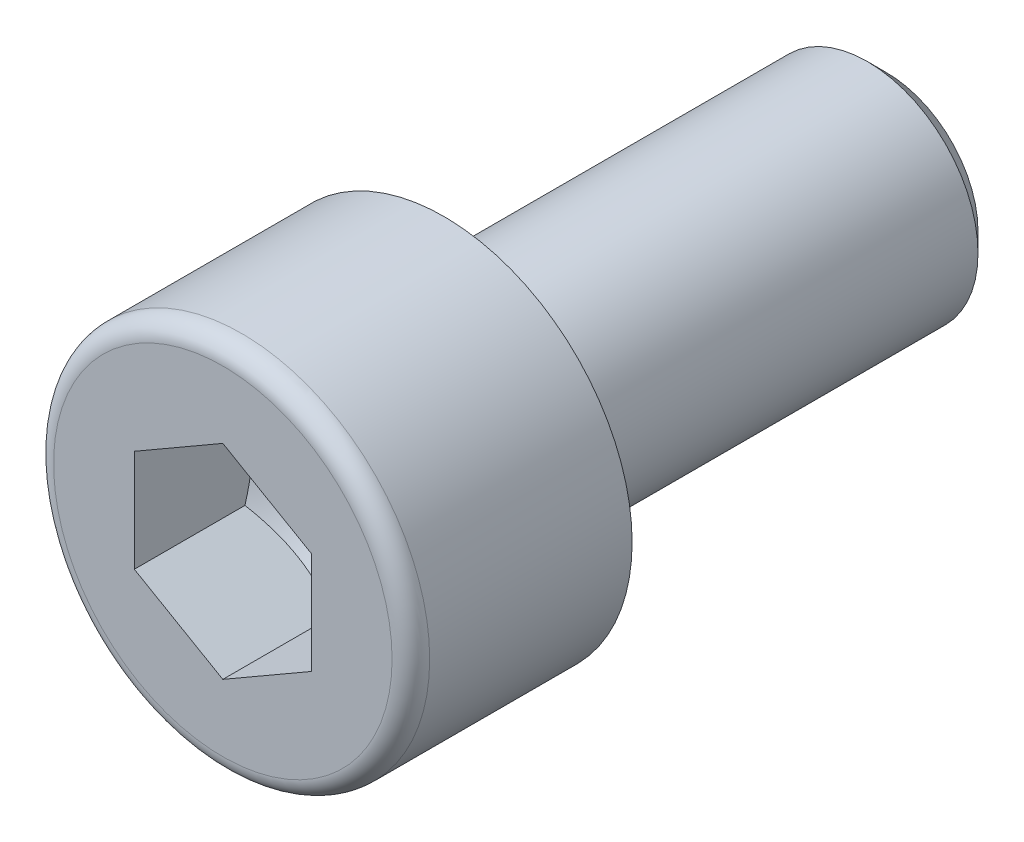
ISO-10303-21;
HEADER;
FILE_DESCRIPTION(('STEP AP214'),'2;1');
FILE_NAME('part.step','',(''),(''),'','','');
FILE_SCHEMA(('AUTOMOTIVE_DESIGN { 1 0 10303 214 1 1 1 1 }'));
ENDSEC;
DATA;
#1=APPLICATION_CONTEXT('core data for automotive mechanical design processes');
#2=APPLICATION_PROTOCOL_DEFINITION('international standard','automotive_design',2000,#1);
#3=PRODUCT_CONTEXT('',#1,'mechanical');
#4=PRODUCT('Part','Part','',(#3));
#5=PRODUCT_RELATED_PRODUCT_CATEGORY('part','',(#4));
#6=PRODUCT_DEFINITION_FORMATION('','',#4);
#7=PRODUCT_DEFINITION_CONTEXT('part definition',#1,'design');
#8=PRODUCT_DEFINITION('design','',#6,#7);
#9=PRODUCT_DEFINITION_SHAPE('','',#8);
#10=(LENGTH_UNIT() NAMED_UNIT(*) SI_UNIT(.MILLI.,.METRE.));
#11=(NAMED_UNIT(*) PLANE_ANGLE_UNIT() SI_UNIT($,.RADIAN.));
#12=(NAMED_UNIT(*) SI_UNIT($,.STERADIAN.) SOLID_ANGLE_UNIT());
#13=UNCERTAINTY_MEASURE_WITH_UNIT(LENGTH_MEASURE(1.E-05),#10,'distance_accuracy_value','');
#14=(GEOMETRIC_REPRESENTATION_CONTEXT(3) GLOBAL_UNCERTAINTY_ASSIGNED_CONTEXT((#13)) GLOBAL_UNIT_ASSIGNED_CONTEXT((#10,
#11,#12)) REPRESENTATION_CONTEXT('',''));
#15=CARTESIAN_POINT('',(0.,0.,0.));
#16=DIRECTION('',(0.,0.,1.));
#17=DIRECTION('',(1.,0.,0.));
#18=AXIS2_PLACEMENT_3D('',#15,#16,#17);
#19=CARTESIAN_POINT('',(0.,0.,5.));
#20=DIRECTION('',(0.,0.,1.));
#21=DIRECTION('',(1.,0.,0.));
#22=AXIS2_PLACEMENT_3D('',#19,#20,#21);
#23=PLANE('',#22);
#24=CARTESIAN_POINT('',(0.,0.,5.));
#25=DIRECTION('',(0.,0.,1.));
#26=DIRECTION('',(1.,0.,0.));
#27=AXIS2_PLACEMENT_3D('',#24,#25,#26);
#28=CIRCLE('',#27,3.825);
#29=CARTESIAN_POINT('',(3.825,0.,5.));
#30=VERTEX_POINT('',#29);
#31=EDGE_CURVE('E11',#30,#30,#28,.T.);
#32=ORIENTED_EDGE('',*,*,#31,.T.);
#33=EDGE_LOOP('',(#32));
#34=FACE_BOUND('',#33,.T.);
#35=DIRECTION('',(0.,-1.,0.));
#36=VECTOR('',#35,1.);
#37=CARTESIAN_POINT('',(1.99999906749978,1.1547,5.));
#38=LINE('',#37,#36);
#39=CARTESIAN_POINT('',(1.99999906749978,1.1547,5.));
#40=VERTEX_POINT('',#39);
#41=CARTESIAN_POINT('',(1.99999906749978,-1.1547,5.));
#42=VERTEX_POINT('',#41);
#43=EDGE_CURVE('E92',#40,#42,#38,.T.);
#44=ORIENTED_EDGE('',*,*,#43,.T.);
#45=DIRECTION('',(-0.866025403784438,-0.5,0.));
#46=VECTOR('',#45,1.);
#47=CARTESIAN_POINT('',(1.99999906749978,-1.1547,5.));
#48=LINE('',#47,#46);
#49=CARTESIAN_POINT('',(0.,-2.3094,5.));
#50=VERTEX_POINT('',#49);
#51=EDGE_CURVE('E31',#42,#50,#48,.T.);
#52=ORIENTED_EDGE('',*,*,#51,.T.);
#53=DIRECTION('',(-0.866025403784439,0.5,0.));
#54=VECTOR('',#53,1.);
#55=CARTESIAN_POINT('',(0.,-2.3094,5.));
#56=LINE('',#55,#54);
#57=CARTESIAN_POINT('',(-1.99999906749978,-1.1547,5.));
#58=VERTEX_POINT('',#57);
#59=EDGE_CURVE('E169',#50,#58,#56,.T.);
#60=ORIENTED_EDGE('',*,*,#59,.T.);
#61=DIRECTION('',(0.,1.,0.));
#62=VECTOR('',#61,1.);
#63=CARTESIAN_POINT('',(-1.99999906749978,-1.1547,5.));
#64=LINE('',#63,#62);
#65=CARTESIAN_POINT('',(-1.99999906749978,1.1547,5.));
#66=VERTEX_POINT('',#65);
#67=EDGE_CURVE('E165',#58,#66,#64,.T.);
#68=ORIENTED_EDGE('',*,*,#67,.T.);
#69=DIRECTION('',(0.866025403784439,0.5,0.));
#70=VECTOR('',#69,1.);
#71=CARTESIAN_POINT('',(-1.99999906749978,1.1547,5.));
#72=LINE('',#71,#70);
#73=CARTESIAN_POINT('',(0.,2.3094,5.));
#74=VERTEX_POINT('',#73);
#75=EDGE_CURVE('E160',#66,#74,#72,.T.);
#76=ORIENTED_EDGE('',*,*,#75,.T.);
#77=DIRECTION('',(0.866025403784439,-0.5,0.));
#78=VECTOR('',#77,1.);
#79=CARTESIAN_POINT('',(0.,2.3094,5.));
#80=LINE('',#79,#78);
#81=EDGE_CURVE('E96',#74,#40,#80,.T.);
#82=ORIENTED_EDGE('',*,*,#81,.T.);
#83=EDGE_LOOP('',(#44,#52,#60,#68,#76,#82));
#84=FACE_BOUND('',#83,.T.);
#85=ADVANCED_FACE('F17',(#34,#84),#23,.T.);
#86=CARTESIAN_POINT('',(0.,0.,4.575));
#87=DIRECTION('',(0.,0.,1.));
#88=DIRECTION('',(1.,0.,0.));
#89=AXIS2_PLACEMENT_3D('',#86,#87,#88);
#90=TOROIDAL_SURFACE('',#89,3.825,0.425);
#91=ORIENTED_EDGE('',*,*,#31,.F.);
#92=EDGE_LOOP('',(#91));
#93=FACE_BOUND('',#92,.T.);
#94=CARTESIAN_POINT('',(0.,0.,4.575));
#95=DIRECTION('',(0.,0.,1.));
#96=DIRECTION('',(1.,0.,0.));
#97=AXIS2_PLACEMENT_3D('',#94,#95,#96);
#98=CIRCLE('',#97,4.25);
#99=CARTESIAN_POINT('',(4.25,0.,4.575));
#100=VERTEX_POINT('',#99);
#101=EDGE_CURVE('E24',#100,#100,#98,.T.);
#102=ORIENTED_EDGE('',*,*,#101,.T.);
#103=EDGE_LOOP('',(#102));
#104=FACE_BOUND('',#103,.T.);
#105=ADVANCED_FACE('F133',(#93,#104),#90,.T.);
#106=CARTESIAN_POINT('',(0.,0.,5.));
#107=DIRECTION('',(0.,0.,1.));
#108=DIRECTION('',(1.,0.,0.));
#109=AXIS2_PLACEMENT_3D('',#106,#107,#108);
#110=CYLINDRICAL_SURFACE('',#109,4.25);
#111=CARTESIAN_POINT('',(0.,0.,0.));
#112=DIRECTION('',(0.,0.,1.));
#113=DIRECTION('',(1.,0.,0.));
#114=AXIS2_PLACEMENT_3D('',#111,#112,#113);
#115=CIRCLE('',#114,4.25);
#116=CARTESIAN_POINT('',(4.25,0.,0.));
#117=VERTEX_POINT('',#116);
#118=EDGE_CURVE('E128',#117,#117,#115,.T.);
#119=ORIENTED_EDGE('',*,*,#118,.T.);
#120=EDGE_LOOP('',(#119));
#121=FACE_BOUND('',#120,.T.);
#122=ORIENTED_EDGE('',*,*,#101,.F.);
#123=EDGE_LOOP('',(#122));
#124=FACE_BOUND('',#123,.T.);
#125=ADVANCED_FACE('F135',(#121,#124),#110,.T.);
#126=CARTESIAN_POINT('',(0.,4.25,0.));
#127=DIRECTION('',(0.,0.,-1.));
#128=DIRECTION('',(-1.,0.,0.));
#129=AXIS2_PLACEMENT_3D('',#126,#127,#128);
#130=PLANE('',#129);
#131=CARTESIAN_POINT('',(0.,0.,0.));
#132=DIRECTION('',(0.,0.,1.));
#133=DIRECTION('',(1.,0.,0.));
#134=AXIS2_PLACEMENT_3D('',#131,#132,#133);
#135=CIRCLE('',#134,2.75);
#136=CARTESIAN_POINT('',(2.75,0.,0.));
#137=VERTEX_POINT('',#136);
#138=EDGE_CURVE('E125',#137,#137,#135,.T.);
#139=ORIENTED_EDGE('',*,*,#138,.T.);
#140=EDGE_LOOP('',(#139));
#141=FACE_BOUND('',#140,.T.);
#142=ORIENTED_EDGE('',*,*,#118,.F.);
#143=EDGE_LOOP('',(#142));
#144=FACE_BOUND('',#143,.T.);
#145=ADVANCED_FACE('F137',(#141,#144),#130,.T.);
#146=CARTESIAN_POINT('',(0.,0.,-0.25));
#147=DIRECTION('',(0.,0.,1.));
#148=DIRECTION('',(1.,0.,0.));
#149=AXIS2_PLACEMENT_3D('',#146,#147,#148);
#150=TOROIDAL_SURFACE('',#149,2.75,0.25);
#151=CARTESIAN_POINT('',(0.,0.,-0.25));
#152=DIRECTION('',(0.,0.,1.));
#153=DIRECTION('',(1.,0.,0.));
#154=AXIS2_PLACEMENT_3D('',#151,#152,#153);
#155=CIRCLE('',#154,2.5);
#156=CARTESIAN_POINT('',(2.5,0.,-0.25));
#157=VERTEX_POINT('',#156);
#158=EDGE_CURVE('E122',#157,#157,#155,.T.);
#159=ORIENTED_EDGE('',*,*,#158,.T.);
#160=EDGE_LOOP('',(#159));
#161=FACE_BOUND('',#160,.T.);
#162=ORIENTED_EDGE('',*,*,#138,.F.);
#163=EDGE_LOOP('',(#162));
#164=FACE_BOUND('',#163,.T.);
#165=ADVANCED_FACE('F145',(#161,#164),#150,.F.);
#166=CARTESIAN_POINT('',(0.,0.,5.));
#167=DIRECTION('',(0.,0.,1.));
#168=DIRECTION('',(1.,0.,0.));
#169=AXIS2_PLACEMENT_3D('',#166,#167,#168);
#170=CYLINDRICAL_SURFACE('',#169,2.5);
#171=CARTESIAN_POINT('',(0.,0.,-0.251));
#172=DIRECTION('',(0.,0.,1.));
#173=DIRECTION('',(1.,0.,0.));
#174=AXIS2_PLACEMENT_3D('',#171,#172,#173);
#175=CIRCLE('',#174,2.5);
#176=CARTESIAN_POINT('',(2.5,0.,-0.251));
#177=VERTEX_POINT('',#176);
#178=EDGE_CURVE('E119',#177,#177,#175,.T.);
#179=ORIENTED_EDGE('',*,*,#178,.T.);
#180=EDGE_LOOP('',(#179));
#181=FACE_BOUND('',#180,.T.);
#182=ORIENTED_EDGE('',*,*,#158,.F.);
#183=EDGE_LOOP('',(#182));
#184=FACE_BOUND('',#183,.T.);
#185=ADVANCED_FACE('F312',(#181,#184),#170,.T.);
#186=CARTESIAN_POINT('',(0.,0.,-0.251));
#187=DIRECTION('',(0.,0.,1.));
#188=DIRECTION('',(1.,0.,0.));
#189=AXIS2_PLACEMENT_3D('',#186,#187,#188);
#190=CONICAL_SURFACE('',#189,2.5,0.524755823658084);
#191=CARTESIAN_POINT('',(0.,0.,-0.998977999677323));
#192=DIRECTION('',(0.,0.,1.));
#193=DIRECTION('',(1.,0.,0.));
#194=AXIS2_PLACEMENT_3D('',#191,#192,#193);
#195=CIRCLE('',#194,2.067);
#196=CARTESIAN_POINT('',(2.067,0.,-0.998977999677323));
#197=VERTEX_POINT('',#196);
#198=EDGE_CURVE('E116',#197,#197,#195,.T.);
#199=ORIENTED_EDGE('',*,*,#198,.T.);
#200=EDGE_LOOP('',(#199));
#201=FACE_BOUND('',#200,.T.);
#202=ORIENTED_EDGE('',*,*,#178,.F.);
#203=EDGE_LOOP('',(#202));
#204=FACE_BOUND('',#203,.T.);
#205=ADVANCED_FACE('F304',(#201,#204),#190,.T.);
#206=CARTESIAN_POINT('',(0.,2.067,-0.998977999677323));
#207=DIRECTION('',(0.,0.,1.));
#208=DIRECTION('',(1.,0.,0.));
#209=AXIS2_PLACEMENT_3D('',#206,#207,#208);
#210=PLANE('',#209);
#211=CARTESIAN_POINT('',(0.,0.,-0.998977999677323));
#212=DIRECTION('',(0.,0.,1.));
#213=DIRECTION('',(1.,0.,0.));
#214=AXIS2_PLACEMENT_3D('',#211,#212,#213);
#215=CIRCLE('',#214,2.5);
#216=CARTESIAN_POINT('',(2.5,0.,-0.998977999677323));
#217=VERTEX_POINT('',#216);
#218=EDGE_CURVE('E113',#217,#217,#215,.T.);
#219=ORIENTED_EDGE('',*,*,#218,.T.);
#220=EDGE_LOOP('',(#219));
#221=FACE_BOUND('',#220,.T.);
#222=ORIENTED_EDGE('',*,*,#198,.F.);
#223=EDGE_LOOP('',(#222));
#224=FACE_BOUND('',#223,.T.);
#225=ADVANCED_FACE('F296',(#221,#224),#210,.T.);
#226=CARTESIAN_POINT('',(0.,0.,5.));
#227=DIRECTION('',(0.,0.,1.));
#228=DIRECTION('',(1.,0.,0.));
#229=AXIS2_PLACEMENT_3D('',#226,#227,#228);
#230=CYLINDRICAL_SURFACE('',#229,2.5);
#231=CARTESIAN_POINT('',(0.,0.,-9.567));
#232=DIRECTION('',(0.,0.,1.));
#233=DIRECTION('',(1.,0.,0.));
#234=AXIS2_PLACEMENT_3D('',#231,#232,#233);
#235=CIRCLE('',#234,2.5);
#236=CARTESIAN_POINT('',(2.5,0.,-9.567));
#237=VERTEX_POINT('',#236);
#238=EDGE_CURVE('E110',#237,#237,#235,.T.);
#239=ORIENTED_EDGE('',*,*,#238,.T.);
#240=EDGE_LOOP('',(#239));
#241=FACE_BOUND('',#240,.T.);
#242=ORIENTED_EDGE('',*,*,#218,.F.);
#243=EDGE_LOOP('',(#242));
#244=FACE_BOUND('',#243,.T.);
#245=ADVANCED_FACE('F288',(#241,#244),#230,.T.);
#246=CARTESIAN_POINT('',(0.,0.,-9.567));
#247=DIRECTION('',(0.,0.,1.));
#248=DIRECTION('',(1.,0.,0.));
#249=AXIS2_PLACEMENT_3D('',#246,#247,#248);
#250=CONICAL_SURFACE('',#249,2.5,0.785398163397448);
#251=CARTESIAN_POINT('',(0.,0.,-10.));
#252=DIRECTION('',(0.,0.,1.));
#253=DIRECTION('',(1.,0.,0.));
#254=AXIS2_PLACEMENT_3D('',#251,#252,#253);
#255=CIRCLE('',#254,2.067);
#256=CARTESIAN_POINT('',(2.067,0.,-10.));
#257=VERTEX_POINT('',#256);
#258=EDGE_CURVE('E107',#257,#257,#255,.T.);
#259=ORIENTED_EDGE('',*,*,#258,.T.);
#260=EDGE_LOOP('',(#259));
#261=FACE_BOUND('',#260,.T.);
#262=ORIENTED_EDGE('',*,*,#238,.F.);
#263=EDGE_LOOP('',(#262));
#264=FACE_BOUND('',#263,.T.);
#265=ADVANCED_FACE('F281',(#261,#264),#250,.T.);
#266=CARTESIAN_POINT('',(0.,2.067,-10.));
#267=DIRECTION('',(0.,0.,-1.));
#268=DIRECTION('',(-1.,0.,0.));
#269=AXIS2_PLACEMENT_3D('',#266,#267,#268);
#270=PLANE('',#269);
#271=ORIENTED_EDGE('',*,*,#258,.F.);
#272=EDGE_LOOP('',(#271));
#273=FACE_BOUND('',#272,.T.);
#274=ADVANCED_FACE('F225',(#273),#270,.T.);
#275=CARTESIAN_POINT('',(1.99999906749978,-1.1547,1.16666728833348));
#276=DIRECTION('',(-0.5,0.866025403784439,0.));
#277=DIRECTION('',(0.866025403784438,0.5,0.));
#278=AXIS2_PLACEMENT_3D('',#275,#276,#277);
#279=PLANE('',#278);
#280=DIRECTION('',(0.,0.,1.));
#281=VECTOR('',#280,1.);
#282=CARTESIAN_POINT('',(0.,-2.3094,1.16666728833348));
#283=LINE('',#282,#281);
#284=CARTESIAN_POINT('',(0.,-2.3094,2.5));
#285=VERTEX_POINT('',#284);
#286=EDGE_CURVE('E105',#285,#50,#283,.T.);
#287=ORIENTED_EDGE('',*,*,#286,.T.);
#288=ORIENTED_EDGE('',*,*,#51,.F.);
#289=DIRECTION('',(0.,0.,1.));
#290=VECTOR('',#289,1.);
#291=CARTESIAN_POINT('',(1.99999906749978,-1.1547,1.16666728833348));
#292=LINE('',#291,#290);
#293=CARTESIAN_POINT('',(1.99999906749978,-1.1547,2.5));
#294=VERTEX_POINT('',#293);
#295=EDGE_CURVE('E86',#294,#42,#292,.T.);
#296=ORIENTED_EDGE('',*,*,#295,.F.);
#297=CARTESIAN_POINT('',(-1.99999999564114E-07,-2.30940011547005,2.50000006666667));
#298=CARTESIAN_POINT('',(0.0878876499603639,-2.25865804163694,2.47069561998081));
#299=CARTESIAN_POINT('',(0.176534146583836,-2.20747796294866,2.44404475856418));
#300=CARTESIAN_POINT('',(0.355361994897665,-2.10423165658607,2.39752647848201));
#301=CARTESIAN_POINT('',(0.445546522980522,-2.0521635950207,2.37767551442774));
#302=CARTESIAN_POINT('',(0.624797967396914,-1.94867272533426,2.34677605509165));
#303=CARTESIAN_POINT('',(0.713837311310269,-1.89726583615742,2.33552188284868));
#304=CARTESIAN_POINT('',(0.892334740485718,-1.79421029737332,2.32208925777583));
#305=CARTESIAN_POINT('',(0.981792177402557,-1.74256202208837,2.31989967890714));
#306=CARTESIAN_POINT('',(1.14893382788061,-1.64606274519206,2.32446636389861));
#307=CARTESIAN_POINT('',(1.2266431222988,-1.60119726314119,2.33010135522432));
#308=CARTESIAN_POINT('',(1.38155546038545,-1.51175858304606,2.34795736540739));
#309=CARTESIAN_POINT('',(1.45875796865268,-1.46718569411587,2.36018447788392));
#310=CARTESIAN_POINT('',(1.61398944124535,-1.37756276162779,2.39074989508433));
#311=CARTESIAN_POINT('',(1.69199876882547,-1.3325240553501,2.40921770427432));
#312=CARTESIAN_POINT('',(1.84685425080366,-1.2431182011445,2.45113182458368));
#313=CARTESIAN_POINT('',(1.92370238755192,-1.19874990870617,2.47456829386259));
#314=CARTESIAN_POINT('',(1.99999926749979,-1.15469988452994,2.50000006666667));
#315=B_SPLINE_CURVE_WITH_KNOTS('',3,(#297,#298,#299,#300,#301,#302,#303,#304,#305,#306,#307,
#308,#309,#310,#311,#312,#313,#314),.UNSPECIFIED.,.F.,.F.,(4,2,2,2,2,2,2,2,4),(0.,
0.317015879560132,0.634793553111489,0.944707212041054,1.25424036459456,1.52370723489002,
1.79342362288273,2.06912103104562,2.3442773610271),.UNSPECIFIED.);
#316=EDGE_CURVE('E79',#285,#294,#315,.T.);
#317=ORIENTED_EDGE('',*,*,#316,.F.);
#318=EDGE_LOOP('',(#287,#288,#296,#317));
#319=FACE_BOUND('',#318,.T.);
#320=ADVANCED_FACE('F87',(#319),#279,.T.);
#321=CARTESIAN_POINT('',(0.,-2.3094,1.16666728833348));
#322=DIRECTION('',(0.5,0.866025403784439,0.));
#323=DIRECTION('',(0.866025403784439,-0.5,0.));
#324=AXIS2_PLACEMENT_3D('',#321,#322,#323);
#325=PLANE('',#324);
#326=DIRECTION('',(0.,0.,1.));
#327=VECTOR('',#326,1.);
#328=CARTESIAN_POINT('',(-1.99999906749978,-1.1547,1.16666728833348));
#329=LINE('',#328,#327);
#330=CARTESIAN_POINT('',(-1.99999906749978,-1.1547,2.5));
#331=VERTEX_POINT('',#330);
#332=EDGE_CURVE('E103',#331,#58,#329,.T.);
#333=ORIENTED_EDGE('',*,*,#332,.T.);
#334=ORIENTED_EDGE('',*,*,#59,.F.);
#335=ORIENTED_EDGE('',*,*,#286,.F.);
#336=CARTESIAN_POINT('',(-1.99999926749979,-1.15469988452995,2.50000006666667));
#337=CARTESIAN_POINT('',(-1.91211141753942,-1.20544195836306,2.47069561998081));
#338=CARTESIAN_POINT('',(-1.82346492091595,-1.25662203705134,2.44404475856418));
#339=CARTESIAN_POINT('',(-1.64463707260212,-1.35986834341393,2.39752647848201));
#340=CARTESIAN_POINT('',(-1.55445254451926,-1.41193640497931,2.37767551442774));
#341=CARTESIAN_POINT('',(-1.37520110010287,-1.51542727466574,2.34677605509165));
#342=CARTESIAN_POINT('',(-1.28616175618951,-1.56683416384258,2.33552188284868));
#343=CARTESIAN_POINT('',(-1.10766432701407,-1.66988970262668,2.32208925777583));
#344=CARTESIAN_POINT('',(-1.01820689009723,-1.72153797791163,2.31989967890714));
#345=CARTESIAN_POINT('',(-0.851065239619171,-1.81803725480794,2.32446636389861));
#346=CARTESIAN_POINT('',(-0.773355945200987,-1.86290273685881,2.33010135522432));
#347=CARTESIAN_POINT('',(-0.618443607114334,-1.95234141695394,2.34795736540739));
#348=CARTESIAN_POINT('',(-0.541241098847105,-1.99691430588413,2.36018447788392));
#349=CARTESIAN_POINT('',(-0.386009626254436,-2.08653723837221,2.39074989508433));
#350=CARTESIAN_POINT('',(-0.30800029867431,-2.1315759446499,2.40921770427432));
#351=CARTESIAN_POINT('',(-0.153144816696121,-2.2209817988555,2.45113182458368));
#352=CARTESIAN_POINT('',(-0.0762966799478604,-2.26535009129383,2.47456829386259));
#353=CARTESIAN_POINT('',(2.00000000726164E-07,-2.30940011547005,2.50000006666667));
#354=B_SPLINE_CURVE_WITH_KNOTS('',3,(#336,#337,#338,#339,#340,#341,#342,#343,#344,#345,#346,
#347,#348,#349,#350,#351,#352,#353),.UNSPECIFIED.,.F.,.F.,(4,2,2,2,2,2,2,2,4),(0.,
0.317015879560133,0.63479355311149,0.944707212041055,1.25424036459457,1.52370723489002,
1.79342362288273,2.06912103104562,2.3442773610271),.UNSPECIFIED.);
#355=EDGE_CURVE('E83',#331,#285,#354,.T.);
#356=ORIENTED_EDGE('',*,*,#355,.F.);
#357=EDGE_LOOP('',(#333,#334,#335,#356));
#358=FACE_BOUND('',#357,.T.);
#359=ADVANCED_FACE('F216',(#358),#325,.T.);
#360=CARTESIAN_POINT('',(-1.99999906749978,-1.1547,1.16666728833348));
#361=DIRECTION('',(1.,0.,0.));
#362=DIRECTION('',(0.,-1.,0.));
#363=AXIS2_PLACEMENT_3D('',#360,#361,#362);
#364=PLANE('',#363);
#365=DIRECTION('',(0.,0.,1.));
#366=VECTOR('',#365,1.);
#367=CARTESIAN_POINT('',(-1.99999906749978,1.1547,1.16666728833348));
#368=LINE('',#367,#366);
#369=CARTESIAN_POINT('',(-1.99999906749978,1.1547,2.5));
#370=VERTEX_POINT('',#369);
#371=EDGE_CURVE('E101',#370,#66,#368,.T.);
#372=ORIENTED_EDGE('',*,*,#371,.T.);
#373=ORIENTED_EDGE('',*,*,#67,.F.);
#374=ORIENTED_EDGE('',*,*,#332,.F.);
#375=CARTESIAN_POINT('',(-1.99999906749978,-2.99028884971983,3.24367023125859));
#376=CARTESIAN_POINT('',(-1.99999906749978,-2.90392200267295,3.20223468621647));
#377=CARTESIAN_POINT('',(-1.99999906749978,-2.81734475421414,3.16122952383127));
#378=CARTESIAN_POINT('',(-1.99999906749978,-2.64365731598497,3.08032411330096));
#379=CARTESIAN_POINT('',(-1.99999906749978,-2.55654703370271,3.04042406400276));
#380=CARTESIAN_POINT('',(-1.99999906749978,-2.38118192435495,2.96175012616847));
#381=CARTESIAN_POINT('',(-1.99999906749978,-2.29292335981865,2.92298453715723));
#382=CARTESIAN_POINT('',(-1.99999906749978,-2.11566562290095,2.84719170488067));
#383=CARTESIAN_POINT('',(-1.99999906749978,-2.02666648931185,2.81016437122897));
#384=CARTESIAN_POINT('',(-1.99999906749978,-1.84544164634707,2.73736806075311));
#385=CARTESIAN_POINT('',(-1.99999906749978,-1.75319241545567,2.70165729627973));
#386=CARTESIAN_POINT('',(-1.99999906749978,-1.56757813222062,2.63320478649593));
#387=CARTESIAN_POINT('',(-1.99999906749978,-1.47421295187584,2.60046338554761));
#388=CARTESIAN_POINT('',(-1.99999906749978,-1.28643386772027,2.53888591579594));
#389=CARTESIAN_POINT('',(-1.99999906749978,-1.19202295786325,2.51004081538517));
#390=CARTESIAN_POINT('',(-1.99999906749978,-1.00184812908896,2.45724234487644));
#391=CARTESIAN_POINT('',(-1.99999906749978,-0.906084552535278,2.43328775988209));
#392=CARTESIAN_POINT('',(-1.99999906749978,-0.713403648485447,2.39154750443778));
#393=CARTESIAN_POINT('',(-1.99999906749978,-0.616489120401374,2.37374916380524));
#394=CARTESIAN_POINT('',(-1.99999906749978,-0.42157646299572,2.34548602757569));
#395=CARTESIAN_POINT('',(-1.99999906749978,-0.323578407355557,2.33502073639859));
#396=CARTESIAN_POINT('',(-1.99999906749978,-0.128212352019511,2.32239776567762));
#397=CARTESIAN_POINT('',(-1.99999906749978,-0.030850871659221,2.32014205033525));
#398=CARTESIAN_POINT('',(-1.99999906749978,0.163710831551626,2.32386608230566));
#399=CARTESIAN_POINT('',(-1.99999906749978,0.26091104404404,2.32984633955672));
#400=CARTESIAN_POINT('',(-1.99999906749978,0.500738265829636,2.35423686693056));
#401=CARTESIAN_POINT('',(-1.99999906749978,0.64290057980671,2.3772180437376));
#402=CARTESIAN_POINT('',(-1.99999906749978,0.924460633304962,2.43647980413544));
#403=CARTESIAN_POINT('',(-1.99999906749978,1.06385482651221,2.47277641670214));
#404=CARTESIAN_POINT('',(-1.99999906749978,1.27233418257961,2.53477991342456));
#405=CARTESIAN_POINT('',(-1.99999906749978,1.3424969927754,2.55699669005728));
#406=CARTESIAN_POINT('',(-1.99999906749978,1.4820922624746,2.60348542116996));
#407=CARTESIAN_POINT('',(-1.99999906749978,1.55152514777521,2.62775609306022));
#408=CARTESIAN_POINT('',(-1.99999906749978,1.68975335668641,2.67800013450483));
#409=CARTESIAN_POINT('',(-1.99999906749978,1.75854879358428,2.7039731946194));
#410=CARTESIAN_POINT('',(-1.99999906749978,1.8955975826986,2.75734107186621));
#411=CARTESIAN_POINT('',(-1.99999906749978,1.96385084106716,2.78473612921014));
#412=CARTESIAN_POINT('',(-1.99999906749979,2.13806939750091,2.8564177262467));
#413=CARTESIAN_POINT('',(-1.99999906749978,2.24368634423216,2.90155001152496));
#414=CARTESIAN_POINT('',(-1.99999906749978,2.45396648374909,2.99399021032121));
#415=CARTESIAN_POINT('',(-1.99999906749978,2.55862960438045,3.04129828682164));
#416=CARTESIAN_POINT('',(-1.99999906749978,2.87150603811662,3.18571921410079));
#417=CARTESIAN_POINT('',(-1.99999906749978,3.07857147539963,3.28531395696867));
#418=CARTESIAN_POINT('',(-1.99999906749978,3.49093332155181,3.4886804302117));
#419=CARTESIAN_POINT('',(-1.99999906749978,3.69622724277651,3.59245714496438));
#420=CARTESIAN_POINT('',(-1.99999906749978,4.10540852709294,3.80267901358096));
#421=CARTESIAN_POINT('',(-1.99999906749978,4.30929606480905,3.90912382826654));
#422=CARTESIAN_POINT('',(-1.99999906749978,4.69689950828494,4.11371795607855));
#423=CARTESIAN_POINT('',(-1.99999906749978,4.8807029700761,4.21170196989814));
#424=CARTESIAN_POINT('',(-1.99999906749978,5.24771864993436,4.40878643004555));
#425=CARTESIAN_POINT('',(-1.99999906749978,5.43093084579657,4.50788691768887));
#426=CARTESIAN_POINT('',(-1.99999906749978,5.79643429025497,4.70667121806156));
#427=CARTESIAN_POINT('',(-1.99999906749978,5.97872669600887,4.80635290597446));
#428=CARTESIAN_POINT('',(-1.99999906749978,6.34294295437126,5.00636506871073));
#429=CARTESIAN_POINT('',(-1.99999906749978,6.52486682576756,5.10669550930892));
#430=CARTESIAN_POINT('',(-1.99999906749978,6.70665829095756,5.20726384914269));
#431=B_SPLINE_CURVE_WITH_KNOTS('',3,(#375,#376,#377,#378,#379,#380,#381,#382,#383,#384,#385,
#386,#387,#388,#389,#390,#391,#392,#393,#394,#395,#396,#397,#398,#399,#400,#401,#402,#403,#404,
#405,#406,#407,#408,#409,#410,#411,#412,#413,#414,#415,#416,#417,#418,#419,#420,#421,#422,#423,
#424,#425,#426,#427,#428,#429,#430),.UNSPECIFIED.,.F.,.F.,(4,2,2,2,2,2,2,2,2,2,2,2,2,2,2,2,2,2,
2,2,2,2,2,2,2,2,2,4),(0.,0.287380545274177,0.574812468369386,0.86398796372822,1.15314840574848,
1.44986914388976,1.746624249349,2.04267922004194,2.33866055535834,2.63402905461025,
2.92937759042583,3.22118738911435,3.51301525630366,3.94415234637607,4.37581014679684,
4.59657452142456,4.81720203917243,5.03778956450958,5.25841447476313,5.6029464492371,
5.94750427380484,6.63673372523485,7.32681046609712,8.01679992246814,8.64166451431098,
9.26655230593667,9.88985069019105,10.5131164561228),.UNSPECIFIED.);
#432=EDGE_CURVE('E207',#370,#331,#431,.F.);
#433=ORIENTED_EDGE('',*,*,#432,.F.);
#434=EDGE_LOOP('',(#372,#373,#374,#433));
#435=FACE_BOUND('',#434,.T.);
#436=ADVANCED_FACE('F212',(#435),#364,.T.);
#437=CARTESIAN_POINT('',(-1.99999906749978,1.1547,1.16666728833348));
#438=DIRECTION('',(0.5,-0.866025403784438,0.));
#439=DIRECTION('',(-0.866025403784439,-0.5,0.));
#440=AXIS2_PLACEMENT_3D('',#437,#438,#439);
#441=PLANE('',#440);
#442=DIRECTION('',(0.,0.,1.));
#443=VECTOR('',#442,1.);
#444=CARTESIAN_POINT('',(0.,2.3094,1.16666728833348));
#445=LINE('',#444,#443);
#446=CARTESIAN_POINT('',(0.,2.3094,2.5));
#447=VERTEX_POINT('',#446);
#448=EDGE_CURVE('E94',#447,#74,#445,.T.);
#449=ORIENTED_EDGE('',*,*,#448,.T.);
#450=ORIENTED_EDGE('',*,*,#75,.F.);
#451=ORIENTED_EDGE('',*,*,#371,.F.);
#452=CARTESIAN_POINT('',(2.00000000771115E-07,2.30940011547005,2.50000006666667));
#453=CARTESIAN_POINT('',(-0.0878876499603633,2.25865804163694,2.47069561998082));
#454=CARTESIAN_POINT('',(-0.176534146583836,2.20747796294866,2.44404475856418));
#455=CARTESIAN_POINT('',(-0.355361994897665,2.10423165658607,2.39752647848201));
#456=CARTESIAN_POINT('',(-0.445546522980521,2.0521635950207,2.37767551442774));
#457=CARTESIAN_POINT('',(-0.624797967396914,1.94867272533426,2.34677605509165));
#458=CARTESIAN_POINT('',(-0.713837311310269,1.89726583615742,2.33552188284868));
#459=CARTESIAN_POINT('',(-0.892334740485717,1.79421029737332,2.32208925777583));
#460=CARTESIAN_POINT('',(-0.981792177402555,1.74256202208837,2.31989967890714));
#461=CARTESIAN_POINT('',(-1.14893382788061,1.64606274519206,2.32446636389861));
#462=CARTESIAN_POINT('',(-1.2266431222988,1.60119726314119,2.33010135522432));
#463=CARTESIAN_POINT('',(-1.38155546038545,1.51175858304607,2.34795736540739));
#464=CARTESIAN_POINT('',(-1.45875796865268,1.46718569411587,2.36018447788392));
#465=CARTESIAN_POINT('',(-1.61398944124535,1.37756276162779,2.39074989508433));
#466=CARTESIAN_POINT('',(-1.69199876882547,1.3325240553501,2.40921770427432));
#467=CARTESIAN_POINT('',(-1.84685425080366,1.2431182011445,2.45113182458368));
#468=CARTESIAN_POINT('',(-1.92370238755192,1.19874990870617,2.47456829386259));
#469=CARTESIAN_POINT('',(-1.99999926749979,1.15469988452995,2.50000006666667));
#470=B_SPLINE_CURVE_WITH_KNOTS('',3,(#452,#453,#454,#455,#456,#457,#458,#459,#460,#461,#462,
#463,#464,#465,#466,#467,#468,#469),.UNSPECIFIED.,.F.,.F.,(4,2,2,2,2,2,2,2,4),(0.,
0.317015879560132,0.634793553111489,0.944707212041053,1.25424036459456,1.52370723489002,
1.79342362288273,2.06912103104562,2.3442773610271),.UNSPECIFIED.);
#471=EDGE_CURVE('E202',#447,#370,#470,.T.);
#472=ORIENTED_EDGE('',*,*,#471,.F.);
#473=EDGE_LOOP('',(#449,#450,#451,#472));
#474=FACE_BOUND('',#473,.T.);
#475=ADVANCED_FACE('F215',(#474),#441,.T.);
#476=CARTESIAN_POINT('',(0.,2.3094,1.16666728833348));
#477=DIRECTION('',(-0.5,-0.866025403784439,0.));
#478=DIRECTION('',(-0.866025403784439,0.5,0.));
#479=AXIS2_PLACEMENT_3D('',#476,#477,#478);
#480=PLANE('',#479);
#481=DIRECTION('',(0.,0.,1.));
#482=VECTOR('',#481,1.);
#483=CARTESIAN_POINT('',(1.99999906749978,1.1547,1.16666728833348));
#484=LINE('',#483,#482);
#485=CARTESIAN_POINT('',(1.99999906749978,1.1547,2.5));
#486=VERTEX_POINT('',#485);
#487=EDGE_CURVE('E91',#486,#40,#484,.T.);
#488=ORIENTED_EDGE('',*,*,#487,.T.);
#489=ORIENTED_EDGE('',*,*,#81,.F.);
#490=ORIENTED_EDGE('',*,*,#448,.F.);
#491=CARTESIAN_POINT('',(1.99999926749978,1.15469988452995,2.50000006666667));
#492=CARTESIAN_POINT('',(1.91211141753942,1.20544195836306,2.47069561998081));
#493=CARTESIAN_POINT('',(1.82346492091594,1.25662203705134,2.44404475856418));
#494=CARTESIAN_POINT('',(1.64463707260212,1.35986834341393,2.39752647848201));
#495=CARTESIAN_POINT('',(1.55445254451926,1.41193640497931,2.37767551442774));
#496=CARTESIAN_POINT('',(1.37520110010287,1.51542727466574,2.34677605509165));
#497=CARTESIAN_POINT('',(1.28616175618951,1.56683416384258,2.33552188284868));
#498=CARTESIAN_POINT('',(1.10766432701406,1.66988970262668,2.32208925777583));
#499=CARTESIAN_POINT('',(1.01820689009723,1.72153797791163,2.31989967890714));
#500=CARTESIAN_POINT('',(0.851065239619171,1.81803725480794,2.32446636389861));
#501=CARTESIAN_POINT('',(0.773355945200987,1.86290273685881,2.33010135522432));
#502=CARTESIAN_POINT('',(0.618443607114335,1.95234141695394,2.34795736540739));
#503=CARTESIAN_POINT('',(0.541241098847106,1.99691430588413,2.36018447788392));
#504=CARTESIAN_POINT('',(0.386009626254437,2.08653723837221,2.39074989508432));
#505=CARTESIAN_POINT('',(0.308000298674311,2.1315759446499,2.40921770427432));
#506=CARTESIAN_POINT('',(0.153144816696123,2.2209817988555,2.45113182458368));
#507=CARTESIAN_POINT('',(0.0762966799478619,2.26535009129383,2.47456829386259));
#508=CARTESIAN_POINT('',(-1.99999999375612E-07,2.30940011547005,2.50000006666667));
#509=B_SPLINE_CURVE_WITH_KNOTS('',3,(#491,#492,#493,#494,#495,#496,#497,#498,#499,#500,#501,
#502,#503,#504,#505,#506,#507,#508),.UNSPECIFIED.,.F.,.F.,(4,2,2,2,2,2,2,2,4),(0.,
0.317015879560131,0.634793553111487,0.944707212041051,1.25424036459456,1.52370723489002,
1.79342362288272,2.06912103104562,2.34427736102709),.UNSPECIFIED.);
#510=EDGE_CURVE('E39',#486,#447,#509,.T.);
#511=ORIENTED_EDGE('',*,*,#510,.F.);
#512=EDGE_LOOP('',(#488,#489,#490,#511));
#513=FACE_BOUND('',#512,.T.);
#514=ADVANCED_FACE('F159',(#513),#480,.T.);
#515=CARTESIAN_POINT('',(1.99999906749978,1.1547,1.16666728833348));
#516=DIRECTION('',(-1.,0.,0.));
#517=DIRECTION('',(0.,1.,0.));
#518=AXIS2_PLACEMENT_3D('',#515,#516,#517);
#519=PLANE('',#518);
#520=ORIENTED_EDGE('',*,*,#295,.T.);
#521=ORIENTED_EDGE('',*,*,#43,.F.);
#522=ORIENTED_EDGE('',*,*,#487,.F.);
#523=CARTESIAN_POINT('',(1.99999906749978,-2.99028884971983,3.24367023125859));
#524=CARTESIAN_POINT('',(1.99999906749978,-2.90392200267294,3.20223468621647));
#525=CARTESIAN_POINT('',(1.99999906749978,-2.81734475421414,3.16122952383127));
#526=CARTESIAN_POINT('',(1.99999906749978,-2.64365731598497,3.08032411330096));
#527=CARTESIAN_POINT('',(1.99999906749978,-2.55654703370271,3.04042406400276));
#528=CARTESIAN_POINT('',(1.99999906749978,-2.38118192435495,2.96175012616847));
#529=CARTESIAN_POINT('',(1.99999906749978,-2.29292335981865,2.92298453715723));
#530=CARTESIAN_POINT('',(1.99999906749978,-2.11566562290095,2.84719170488067));
#531=CARTESIAN_POINT('',(1.99999906749978,-2.02666648931184,2.81016437122897));
#532=CARTESIAN_POINT('',(1.99999906749978,-1.84544164634707,2.73736806075311));
#533=CARTESIAN_POINT('',(1.99999906749978,-1.75319241545567,2.70165729627973));
#534=CARTESIAN_POINT('',(1.99999906749978,-1.56757813222062,2.63320478649593));
#535=CARTESIAN_POINT('',(1.99999906749978,-1.47421295187584,2.60046338554761));
#536=CARTESIAN_POINT('',(1.99999906749978,-1.28643386772027,2.53888591579594));
#537=CARTESIAN_POINT('',(1.99999906749978,-1.19202295786325,2.51004081538517));
#538=CARTESIAN_POINT('',(1.99999906749978,-1.00184812908896,2.45724234487644));
#539=CARTESIAN_POINT('',(1.99999906749978,-0.906084552535276,2.43328775988209));
#540=CARTESIAN_POINT('',(1.99999906749978,-0.713403648485444,2.39154750443778));
#541=CARTESIAN_POINT('',(1.99999906749978,-0.616489120401372,2.37374916380524));
#542=CARTESIAN_POINT('',(1.99999906749978,-0.421576462995717,2.34548602757569));
#543=CARTESIAN_POINT('',(1.99999906749978,-0.323578407355555,2.33502073639859));
#544=CARTESIAN_POINT('',(1.99999906749978,-0.128212352019509,2.32239776567762));
#545=CARTESIAN_POINT('',(1.99999906749978,-0.0308508716592184,2.32014205033525));
#546=CARTESIAN_POINT('',(1.99999906749978,0.163710831551629,2.32386608230566));
#547=CARTESIAN_POINT('',(1.99999906749978,0.260911044044043,2.32984633955672));
#548=CARTESIAN_POINT('',(1.99999906749979,0.500738265829638,2.35423686693056));
#549=CARTESIAN_POINT('',(1.99999906749978,0.642900579806712,2.3772180437376));
#550=CARTESIAN_POINT('',(1.99999906749978,0.924460633304965,2.43647980413544));
#551=CARTESIAN_POINT('',(1.99999906749978,1.06385482651221,2.47277641670214));
#552=CARTESIAN_POINT('',(1.99999906749978,1.27233418257962,2.53477991342456));
#553=CARTESIAN_POINT('',(1.99999906749978,1.34249699277541,2.55699669005728));
#554=CARTESIAN_POINT('',(1.99999906749978,1.4820922624746,2.60348542116996));
#555=CARTESIAN_POINT('',(1.99999906749978,1.55152514777521,2.62775609306022));
#556=CARTESIAN_POINT('',(1.99999906749978,1.68975335668642,2.67800013450483));
#557=CARTESIAN_POINT('',(1.99999906749978,1.75854879358428,2.7039731946194));
#558=CARTESIAN_POINT('',(1.99999906749978,1.8955975826986,2.75734107186622));
#559=CARTESIAN_POINT('',(1.99999906749978,1.96385084106717,2.78473612921014));
#560=CARTESIAN_POINT('',(1.99999906749978,2.13806939750092,2.8564177262467));
#561=CARTESIAN_POINT('',(1.99999906749978,2.24368634423216,2.90155001152496));
#562=CARTESIAN_POINT('',(1.99999906749978,2.45396648374909,2.99399021032122));
#563=CARTESIAN_POINT('',(1.99999906749978,2.55862960438045,3.04129828682164));
#564=CARTESIAN_POINT('',(1.99999906749978,2.87150603811663,3.18571921410079));
#565=CARTESIAN_POINT('',(1.99999906749978,3.07857147539964,3.28531395696867));
#566=CARTESIAN_POINT('',(1.99999906749978,3.49093332155182,3.4886804302117));
#567=CARTESIAN_POINT('',(1.99999906749978,3.69622724277651,3.59245714496438));
#568=CARTESIAN_POINT('',(1.99999906749978,4.10540852709294,3.80267901358096));
#569=CARTESIAN_POINT('',(1.99999906749978,4.30929606480906,3.90912382826654));
#570=CARTESIAN_POINT('',(1.99999906749978,4.69689950828494,4.11371795607855));
#571=CARTESIAN_POINT('',(1.99999906749978,4.88070297007611,4.21170196989814));
#572=CARTESIAN_POINT('',(1.99999906749978,5.24771864993436,4.40878643004555));
#573=CARTESIAN_POINT('',(1.99999906749978,5.43093084579658,4.50788691768887));
#574=CARTESIAN_POINT('',(1.99999906749978,5.79643429025497,4.70667121806156));
#575=CARTESIAN_POINT('',(1.99999906749978,5.97872669600888,4.80635290597446));
#576=CARTESIAN_POINT('',(1.99999906749978,6.34294295437126,5.00636506871073));
#577=CARTESIAN_POINT('',(1.99999906749978,6.52486682576756,5.10669550930892));
#578=CARTESIAN_POINT('',(1.99999906749978,6.70665829095756,5.20726384914269));
#579=B_SPLINE_CURVE_WITH_KNOTS('',3,(#523,#524,#525,#526,#527,#528,#529,#530,#531,#532,#533,
#534,#535,#536,#537,#538,#539,#540,#541,#542,#543,#544,#545,#546,#547,#548,#549,#550,#551,#552,
#553,#554,#555,#556,#557,#558,#559,#560,#561,#562,#563,#564,#565,#566,#567,#568,#569,#570,#571,
#572,#573,#574,#575,#576,#577,#578),.UNSPECIFIED.,.F.,.F.,(4,2,2,2,2,2,2,2,2,2,2,2,2,2,2,2,2,2,
2,2,2,2,2,2,2,2,2,4),(0.,0.287380545274177,0.574812468369386,0.86398796372822,1.15314840574848,
1.44986914388976,1.746624249349,2.04267922004194,2.33866055535834,2.63402905461025,
2.92937759042583,3.22118738911435,3.51301525630366,3.94415234637607,4.37581014679684,
4.59657452142457,4.81720203917244,5.03778956450958,5.25841447476314,5.6029464492371,
5.94750427380485,6.63673372523485,7.32681046609712,8.01679992246815,8.64166451431098,
9.26655230593668,9.88985069019105,10.5131164561228),.UNSPECIFIED.);
#580=EDGE_CURVE('E80',#294,#486,#579,.T.);
#581=ORIENTED_EDGE('',*,*,#580,.F.);
#582=EDGE_LOOP('',(#520,#521,#522,#581));
#583=FACE_BOUND('',#582,.T.);
#584=ADVANCED_FACE('F75',(#583),#519,.T.);
#585=CARTESIAN_POINT('',(0.,0.,1.16666728833348));
#586=DIRECTION('',(0.,0.,1.));
#587=DIRECTION('',(1.,0.,0.));
#588=AXIS2_PLACEMENT_3D('',#585,#586,#587);
#589=CONICAL_SURFACE('',#588,0.,1.0471975511966);
#590=CARTESIAN_POINT('',(0.,0.,1.16666728833348));
#591=VERTEX_POINT('',#590);
#592=VERTEX_LOOP('',#591);
#593=FACE_BOUND('',#592,.T.);
#594=ORIENTED_EDGE('',*,*,#316,.T.);
#595=ORIENTED_EDGE('',*,*,#580,.T.);
#596=ORIENTED_EDGE('',*,*,#510,.T.);
#597=ORIENTED_EDGE('',*,*,#471,.T.);
#598=ORIENTED_EDGE('',*,*,#432,.T.);
#599=ORIENTED_EDGE('',*,*,#355,.T.);
#600=EDGE_LOOP('',(#594,#595,#596,#597,#598,#599));
#601=FACE_BOUND('',#600,.T.);
#602=ADVANCED_FACE('F72',(#593,#601),#589,.F.);
#603=CLOSED_SHELL('',(#85,#105,#125,#145,#165,#185,#205,#225,#245,#265,#274,#320,#359,#436,#475,
#514,#584,#602));
#604=MANIFOLD_SOLID_BREP('B1',#603);
#605=ADVANCED_BREP_SHAPE_REPRESENTATION('',(#18,#604),#14);
#606=SHAPE_DEFINITION_REPRESENTATION(#9,#605);
ENDSEC;
END-ISO-10303-21;
